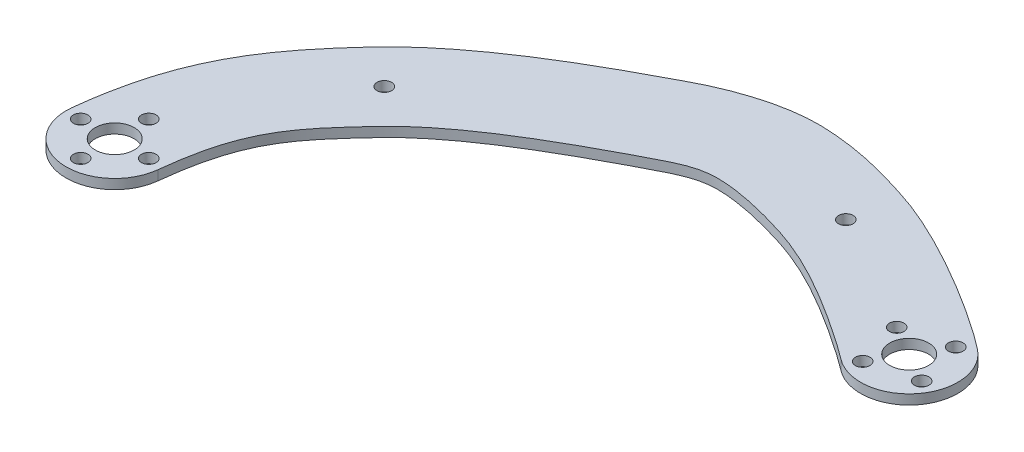
ISO-10303-21;
HEADER;
FILE_DESCRIPTION(('STEP AP214'),'2;1');
FILE_NAME('part.step','',(''),(''),'','','');
FILE_SCHEMA(('AUTOMOTIVE_DESIGN { 1 0 10303 214 1 1 1 1 }'));
ENDSEC;
DATA;
#1=APPLICATION_CONTEXT('core data for automotive mechanical design processes');
#2=APPLICATION_PROTOCOL_DEFINITION('international standard','automotive_design',2000,#1);
#3=PRODUCT_CONTEXT('',#1,'mechanical');
#4=PRODUCT('Part','Part','',(#3));
#5=PRODUCT_RELATED_PRODUCT_CATEGORY('part','',(#4));
#6=PRODUCT_DEFINITION_FORMATION('','',#4);
#7=PRODUCT_DEFINITION_CONTEXT('part definition',#1,'design');
#8=PRODUCT_DEFINITION('design','',#6,#7);
#9=PRODUCT_DEFINITION_SHAPE('','',#8);
#10=(LENGTH_UNIT() NAMED_UNIT(*) SI_UNIT(.MILLI.,.METRE.));
#11=(NAMED_UNIT(*) PLANE_ANGLE_UNIT() SI_UNIT($,.RADIAN.));
#12=(NAMED_UNIT(*) SI_UNIT($,.STERADIAN.) SOLID_ANGLE_UNIT());
#13=UNCERTAINTY_MEASURE_WITH_UNIT(LENGTH_MEASURE(1.E-05),#10,'distance_accuracy_value','');
#14=(GEOMETRIC_REPRESENTATION_CONTEXT(3) GLOBAL_UNCERTAINTY_ASSIGNED_CONTEXT((#13)) GLOBAL_UNIT_ASSIGNED_CONTEXT((#10,
#11,#12)) REPRESENTATION_CONTEXT('',''));
#15=CARTESIAN_POINT('',(0.,0.,0.));
#16=DIRECTION('',(0.,0.,1.));
#17=DIRECTION('',(1.,0.,0.));
#18=AXIS2_PLACEMENT_3D('',#15,#16,#17);
#19=CARTESIAN_POINT('',(-45.8285004379793,-2.,-69.2713280714501));
#20=DIRECTION('',(0.,-1.,0.));
#21=DIRECTION('',(0.,0.,-1.));
#22=AXIS2_PLACEMENT_3D('',#19,#20,#21);
#23=PLANE('',#22);
#24=CARTESIAN_POINT('',(-5.47040483325724,-2.,-60.7458504773583));
#25=DIRECTION('',(0.,1.,0.));
#26=DIRECTION('',(0.,0.,1.));
#27=AXIS2_PLACEMENT_3D('',#24,#25,#26);
#28=CIRCLE('',#27,1.49999999999999);
#29=CARTESIAN_POINT('',(-5.47040483325724,-2.,-59.2458504773583));
#30=VERTEX_POINT('',#29);
#31=EDGE_CURVE('E207',#30,#30,#28,.T.);
#32=ORIENTED_EDGE('',*,*,#31,.T.);
#33=EDGE_LOOP('',(#32));
#34=FACE_BOUND('',#33,.T.);
#35=CARTESIAN_POINT('',(31.0621778264911,-2.,-39.801270189222));
#36=DIRECTION('',(0.,1.,0.));
#37=DIRECTION('',(0.,0.,1.));
#38=AXIS2_PLACEMENT_3D('',#35,#36,#37);
#39=CIRCLE('',#38,1.49999999999999);
#40=CARTESIAN_POINT('',(31.0621778264911,-2.,-38.301270189222));
#41=VERTEX_POINT('',#40);
#42=EDGE_CURVE('E214',#41,#41,#39,.T.);
#43=ORIENTED_EDGE('',*,*,#42,.T.);
#44=EDGE_LOOP('',(#43));
#45=FACE_BOUND('',#44,.T.);
#46=CARTESIAN_POINT('',(-102.,-2.,0.));
#47=DIRECTION('',(0.,1.,0.));
#48=DIRECTION('',(0.,0.,1.));
#49=AXIS2_PLACEMENT_3D('',#46,#47,#48);
#50=CIRCLE('',#49,1.49999999999999);
#51=CARTESIAN_POINT('',(-102.,-2.,1.49999999999996));
#52=VERTEX_POINT('',#51);
#53=EDGE_CURVE('E230',#52,#52,#50,.T.);
#54=ORIENTED_EDGE('',*,*,#53,.T.);
#55=EDGE_LOOP('',(#54));
#56=FACE_BOUND('',#55,.T.);
#57=CARTESIAN_POINT('',(21.5,-2.,-37.2390923627308));
#58=DIRECTION('',(0.,1.,0.));
#59=DIRECTION('',(0.,0.,1.));
#60=AXIS2_PLACEMENT_3D('',#57,#58,#59);
#61=CIRCLE('',#60,1.49999999999999);
#62=CARTESIAN_POINT('',(21.5,-2.,-35.7390923627308));
#63=VERTEX_POINT('',#62);
#64=EDGE_CURVE('E238',#63,#63,#61,.T.);
#65=ORIENTED_EDGE('',*,*,#64,.T.);
#66=EDGE_LOOP('',(#65));
#67=FACE_BOUND('',#66,.T.);
#68=CARTESIAN_POINT('',(-95.,-2.,-7.));
#69=DIRECTION('',(0.,1.,0.));
#70=DIRECTION('',(0.,0.,1.));
#71=AXIS2_PLACEMENT_3D('',#68,#69,#70);
#72=CIRCLE('',#71,1.49999999999999);
#73=CARTESIAN_POINT('',(-95.,-2.,-5.50000000000001));
#74=VERTEX_POINT('',#73);
#75=EDGE_CURVE('E254',#74,#74,#72,.T.);
#76=ORIENTED_EDGE('',*,*,#75,.T.);
#77=EDGE_LOOP('',(#76));
#78=FACE_BOUND('',#77,.T.);
#79=CARTESIAN_POINT('',(-95.,-2.,7.));
#80=DIRECTION('',(0.,1.,0.));
#81=DIRECTION('',(0.,0.,1.));
#82=AXIS2_PLACEMENT_3D('',#79,#80,#81);
#83=CIRCLE('',#82,1.49999999999999);
#84=CARTESIAN_POINT('',(-95.,-2.,8.49999999999999));
#85=VERTEX_POINT('',#84);
#86=EDGE_CURVE('E262',#85,#85,#83,.T.);
#87=ORIENTED_EDGE('',*,*,#86,.T.);
#88=EDGE_LOOP('',(#87));
#89=FACE_BOUND('',#88,.T.);
#90=CARTESIAN_POINT('',(-95.,-2.,0.));
#91=DIRECTION('',(0.,1.,0.));
#92=DIRECTION('',(0.,0.,1.));
#93=AXIS2_PLACEMENT_3D('',#90,#91,#92);
#94=CIRCLE('',#93,3.99999999999999);
#95=CARTESIAN_POINT('',(-95.,-2.,3.99999999999998));
#96=VERTEX_POINT('',#95);
#97=EDGE_CURVE('E278',#96,#96,#94,.T.);
#98=ORIENTED_EDGE('',*,*,#97,.T.);
#99=EDGE_LOOP('',(#98));
#100=FACE_BOUND('',#99,.T.);
#101=CARTESIAN_POINT('',(31.217970731145,-2.,-51.1330541486161));
#102=CARTESIAN_POINT('',(25.2014556905333,-2.,-55.9098093068255));
#103=CARTESIAN_POINT('',(8.34445080884238,-2.,-66.7803505015917));
#104=CARTESIAN_POINT('',(-9.95452359543937,-2.,-72.7368541261571));
#105=CARTESIAN_POINT('',(-16.0661517941738,-2.,-74.5136017831696));
#106=CARTESIAN_POINT('',(-31.4946292124106,-2.,-75.2497131484379));
#107=CARTESIAN_POINT('',(-39.7481312890882,-2.,-72.4528282758718));
#108=CARTESIAN_POINT('',(-57.9892387357613,-2.,-62.9083276626067));
#109=CARTESIAN_POINT('',(-74.5148871539062,-2.,-54.0090213221811));
#110=CARTESIAN_POINT('',(-95.3612296301583,-2.,-31.4574289545693));
#111=CARTESIAN_POINT('',(-102.721578545527,-2.,-21.252373985937));
#112=CARTESIAN_POINT('',(-104.939991114334,-2.,-1.09388145927961));
#113=B_SPLINE_CURVE_WITH_KNOTS('',3,(#101,#102,#103,#104,#105,#106,#107,#108,#109,#110,#111,
#112),.UNSPECIFIED.,.F.,.F.,(4,2,2,2,2,4),(0.,0.25,0.375,0.5,0.75,1.),.UNSPECIFIED.);
#114=CARTESIAN_POINT('',(31.217970731145,-2.,-51.1330541486161));
#115=VERTEX_POINT('',#114);
#116=CARTESIAN_POINT('',(-104.939991114334,-2.,-1.09388145927963));
#117=VERTEX_POINT('',#116);
#118=EDGE_CURVE('E105',#115,#117,#113,.T.);
#119=ORIENTED_EDGE('',*,*,#118,.F.);
#120=CARTESIAN_POINT('',(25.,-2.,-43.3012701892219));
#121=DIRECTION('',(0.,1.,0.));
#122=DIRECTION('',(0.,0.,1.));
#123=AXIS2_PLACEMENT_3D('',#120,#121,#122);
#124=CIRCLE('',#123,10.);
#125=CARTESIAN_POINT('',(18.782029268855,-2.,-35.4694862298277));
#126=VERTEX_POINT('',#125);
#127=EDGE_CURVE('E100',#126,#115,#124,.T.);
#128=ORIENTED_EDGE('',*,*,#127,.F.);
#129=CARTESIAN_POINT('',(-85.0600088856657,-2.,1.09388145927961));
#130=CARTESIAN_POINT('',(-83.2733930868187,-2.,-15.1409171238939));
#131=CARTESIAN_POINT('',(-78.4954168347907,-2.,-20.2491444472598));
#132=CARTESIAN_POINT('',(-62.0101963965591,-2.,-38.0641836130827));
#133=CARTESIAN_POINT('',(-47.2799847653409,-2.,-45.9573966791849));
#134=CARTESIAN_POINT('',(-31.2342855377627,-2.,-54.325875613252));
#135=CARTESIAN_POINT('',(-28.9509837540831,-2.,-55.1128016284582));
#136=CARTESIAN_POINT('',(-20.5534684122021,-2.,-54.7013000009219));
#137=CARTESIAN_POINT('',(-14.7921061287828,-2.,-53.2658446509368));
#138=CARTESIAN_POINT('',(-5.22837928003915,-2.,-50.1740620308894));
#139=CARTESIAN_POINT('',(-0.197175706277112,-2.,-47.7617051834466));
#140=CARTESIAN_POINT('',(11.5843464499819,-2.,-40.6634390769694));
#141=CARTESIAN_POINT('',(17.421875588584,-2.,-36.5493673677186));
#142=CARTESIAN_POINT('',(18.782029268855,-2.,-35.4694862298277));
#143=B_SPLINE_CURVE_WITH_KNOTS('',3,(#129,#130,#131,#132,#133,#134,#135,#136,#137,#138,#139,
#140,#141,#142),.UNSPECIFIED.,.F.,.F.,(4,2,2,2,2,2,4),(0.,0.25,0.5,0.625,0.75,0.875,1.),.UNSPECIFIED.);
#144=CARTESIAN_POINT('',(-85.0600088856657,-2.,1.09388145927961));
#145=VERTEX_POINT('',#144);
#146=EDGE_CURVE('E92',#145,#126,#143,.T.);
#147=ORIENTED_EDGE('',*,*,#146,.F.);
#148=CARTESIAN_POINT('',(-95.,-2.,0.));
#149=DIRECTION('',(0.,1.,0.));
#150=DIRECTION('',(0.,0.,1.));
#151=AXIS2_PLACEMENT_3D('',#148,#149,#150);
#152=CIRCLE('',#151,9.99999999999988);
#153=EDGE_CURVE('E99',#117,#145,#152,.T.);
#154=ORIENTED_EDGE('',*,*,#153,.F.);
#155=EDGE_LOOP('',(#119,#128,#147,#154));
#156=FACE_BOUND('',#155,.T.);
#157=CARTESIAN_POINT('',(25.,-2.,-43.3012701892219));
#158=DIRECTION('',(0.,1.,0.));
#159=DIRECTION('',(0.,0.,1.));
#160=AXIS2_PLACEMENT_3D('',#157,#158,#159);
#161=CIRCLE('',#160,3.99999999999999);
#162=CARTESIAN_POINT('',(25.,-2.,-39.3012701892219));
#163=VERTEX_POINT('',#162);
#164=EDGE_CURVE('E283',#163,#163,#161,.T.);
#165=ORIENTED_EDGE('',*,*,#164,.T.);
#166=EDGE_LOOP('',(#165));
#167=FACE_BOUND('',#166,.T.);
#168=CARTESIAN_POINT('',(18.9378221735089,-2.,-46.8012701892219));
#169=DIRECTION('',(0.,1.,0.));
#170=DIRECTION('',(0.,0.,1.));
#171=AXIS2_PLACEMENT_3D('',#168,#169,#170);
#172=CIRCLE('',#171,1.49999999999999);
#173=CARTESIAN_POINT('',(18.9378221735089,-2.,-45.3012701892219));
#174=VERTEX_POINT('',#173);
#175=EDGE_CURVE('E270',#174,#174,#172,.T.);
#176=ORIENTED_EDGE('',*,*,#175,.T.);
#177=EDGE_LOOP('',(#176));
#178=FACE_BOUND('',#177,.T.);
#179=CARTESIAN_POINT('',(28.5,-2.,-49.363448015713));
#180=DIRECTION('',(0.,1.,0.));
#181=DIRECTION('',(0.,0.,1.));
#182=AXIS2_PLACEMENT_3D('',#179,#180,#181);
#183=CIRCLE('',#182,1.49999999999999);
#184=CARTESIAN_POINT('',(28.5,-2.,-47.863448015713));
#185=VERTEX_POINT('',#184);
#186=EDGE_CURVE('E246',#185,#185,#183,.T.);
#187=ORIENTED_EDGE('',*,*,#186,.T.);
#188=EDGE_LOOP('',(#187));
#189=FACE_BOUND('',#188,.T.);
#190=CARTESIAN_POINT('',(-88.,-2.,0.));
#191=DIRECTION('',(0.,1.,0.));
#192=DIRECTION('',(0.,0.,1.));
#193=AXIS2_PLACEMENT_3D('',#190,#191,#192);
#194=CIRCLE('',#193,1.49999999999999);
#195=CARTESIAN_POINT('',(-88.,-2.,1.49999999999999));
#196=VERTEX_POINT('',#195);
#197=EDGE_CURVE('E222',#196,#196,#194,.T.);
#198=ORIENTED_EDGE('',*,*,#197,.T.);
#199=EDGE_LOOP('',(#198));
#200=FACE_BOUND('',#199,.T.);
#201=CARTESIAN_POINT('',(-76.5973956309098,-2.,-37.0062331272977));
#202=DIRECTION('',(0.,1.,0.));
#203=DIRECTION('',(0.,0.,1.));
#204=AXIS2_PLACEMENT_3D('',#201,#202,#203);
#205=CIRCLE('',#204,1.49999999999999);
#206=CARTESIAN_POINT('',(-76.5973956309098,-2.,-35.5062331272977));
#207=VERTEX_POINT('',#206);
#208=EDGE_CURVE('E192',#207,#207,#205,.T.);
#209=ORIENTED_EDGE('',*,*,#208,.T.);
#210=EDGE_LOOP('',(#209));
#211=FACE_BOUND('',#210,.T.);
#212=ADVANCED_FACE('F41',(#34,#45,#56,#67,#78,#89,#100,#156,#167,#178,#189,#200,#211),#23,.T.);
#213=CARTESIAN_POINT('',(-45.8285004379793,0.,-69.2713280714501));
#214=DIRECTION('',(0.,-1.,0.));
#215=DIRECTION('',(0.,0.,-1.));
#216=AXIS2_PLACEMENT_3D('',#213,#214,#215);
#217=PLANE('',#216);
#218=CARTESIAN_POINT('',(-76.5973956309098,0.,-37.0062331272977));
#219=DIRECTION('',(0.,1.,0.));
#220=DIRECTION('',(0.,0.,1.));
#221=AXIS2_PLACEMENT_3D('',#218,#219,#220);
#222=CIRCLE('',#221,1.49999999999999);
#223=CARTESIAN_POINT('',(-76.5973956309098,0.,-35.5062331272977));
#224=VERTEX_POINT('',#223);
#225=EDGE_CURVE('E195',#224,#224,#222,.T.);
#226=ORIENTED_EDGE('',*,*,#225,.F.);
#227=EDGE_LOOP('',(#226));
#228=FACE_BOUND('',#227,.T.);
#229=CARTESIAN_POINT('',(-102.,0.,0.));
#230=DIRECTION('',(0.,1.,0.));
#231=DIRECTION('',(0.,0.,1.));
#232=AXIS2_PLACEMENT_3D('',#229,#230,#231);
#233=CIRCLE('',#232,1.49999999999999);
#234=CARTESIAN_POINT('',(-102.,0.,1.49999999999996));
#235=VERTEX_POINT('',#234);
#236=EDGE_CURVE('E226',#235,#235,#233,.T.);
#237=ORIENTED_EDGE('',*,*,#236,.F.);
#238=EDGE_LOOP('',(#237));
#239=FACE_BOUND('',#238,.T.);
#240=CARTESIAN_POINT('',(21.5,0.,-37.2390923627308));
#241=DIRECTION('',(0.,1.,0.));
#242=DIRECTION('',(0.,0.,1.));
#243=AXIS2_PLACEMENT_3D('',#240,#241,#242);
#244=CIRCLE('',#243,1.49999999999999);
#245=CARTESIAN_POINT('',(21.5,0.,-35.7390923627308));
#246=VERTEX_POINT('',#245);
#247=EDGE_CURVE('E234',#246,#246,#244,.T.);
#248=ORIENTED_EDGE('',*,*,#247,.F.);
#249=EDGE_LOOP('',(#248));
#250=FACE_BOUND('',#249,.T.);
#251=CARTESIAN_POINT('',(-95.,0.,7.));
#252=DIRECTION('',(0.,1.,0.));
#253=DIRECTION('',(0.,0.,1.));
#254=AXIS2_PLACEMENT_3D('',#251,#252,#253);
#255=CIRCLE('',#254,1.49999999999999);
#256=CARTESIAN_POINT('',(-95.,0.,8.49999999999999));
#257=VERTEX_POINT('',#256);
#258=EDGE_CURVE('E258',#257,#257,#255,.T.);
#259=ORIENTED_EDGE('',*,*,#258,.F.);
#260=EDGE_LOOP('',(#259));
#261=FACE_BOUND('',#260,.T.);
#262=CARTESIAN_POINT('',(-95.,0.,0.));
#263=DIRECTION('',(0.,1.,0.));
#264=DIRECTION('',(0.,0.,1.));
#265=AXIS2_PLACEMENT_3D('',#262,#263,#264);
#266=CIRCLE('',#265,3.99999999999999);
#267=CARTESIAN_POINT('',(-95.,0.,3.99999999999998));
#268=VERTEX_POINT('',#267);
#269=EDGE_CURVE('E274',#268,#268,#266,.T.);
#270=ORIENTED_EDGE('',*,*,#269,.F.);
#271=EDGE_LOOP('',(#270));
#272=FACE_BOUND('',#271,.T.);
#273=CARTESIAN_POINT('',(25.,0.,-43.3012701892219));
#274=DIRECTION('',(0.,1.,0.));
#275=DIRECTION('',(0.,0.,1.));
#276=AXIS2_PLACEMENT_3D('',#273,#274,#275);
#277=CIRCLE('',#276,3.99999999999999);
#278=CARTESIAN_POINT('',(25.,0.,-39.3012701892219));
#279=VERTEX_POINT('',#278);
#280=EDGE_CURVE('E281',#279,#279,#277,.T.);
#281=ORIENTED_EDGE('',*,*,#280,.F.);
#282=EDGE_LOOP('',(#281));
#283=FACE_BOUND('',#282,.T.);
#284=CARTESIAN_POINT('',(31.217970731145,0.,-51.1330541486161));
#285=CARTESIAN_POINT('',(25.2014556905333,0.,-55.9098093068255));
#286=CARTESIAN_POINT('',(8.34445080884238,0.,-66.7803505015917));
#287=CARTESIAN_POINT('',(-9.95452359543937,0.,-72.7368541261571));
#288=CARTESIAN_POINT('',(-16.0661517941738,0.,-74.5136017831696));
#289=CARTESIAN_POINT('',(-31.4946292124106,0.,-75.2497131484379));
#290=CARTESIAN_POINT('',(-39.7481312890882,0.,-72.4528282758718));
#291=CARTESIAN_POINT('',(-57.9892387357613,0.,-62.9083276626067));
#292=CARTESIAN_POINT('',(-74.5148871539062,0.,-54.0090213221811));
#293=CARTESIAN_POINT('',(-95.3612296301583,0.,-31.4574289545693));
#294=CARTESIAN_POINT('',(-102.721578545527,0.,-21.252373985937));
#295=CARTESIAN_POINT('',(-104.939991114334,0.,-1.09388145927961));
#296=B_SPLINE_CURVE_WITH_KNOTS('',3,(#284,#285,#286,#287,#288,#289,#290,#291,#292,#293,#294,
#295),.UNSPECIFIED.,.F.,.F.,(4,2,2,2,2,4),(0.,0.25,0.375,0.5,0.75,1.),.UNSPECIFIED.);
#297=CARTESIAN_POINT('',(31.217970731145,0.,-51.1330541486161));
#298=VERTEX_POINT('',#297);
#299=CARTESIAN_POINT('',(-104.939991114334,0.,-1.09388145927963));
#300=VERTEX_POINT('',#299);
#301=EDGE_CURVE('E286',#298,#300,#296,.T.);
#302=ORIENTED_EDGE('',*,*,#301,.T.);
#303=CARTESIAN_POINT('',(-95.,0.,0.));
#304=DIRECTION('',(0.,1.,0.));
#305=DIRECTION('',(0.,0.,1.));
#306=AXIS2_PLACEMENT_3D('',#303,#304,#305);
#307=CIRCLE('',#306,9.99999999999988);
#308=CARTESIAN_POINT('',(-85.0600088856657,0.,1.09388145927961));
#309=VERTEX_POINT('',#308);
#310=EDGE_CURVE('E292',#300,#309,#307,.T.);
#311=ORIENTED_EDGE('',*,*,#310,.T.);
#312=CARTESIAN_POINT('',(-85.0600088856657,0.,1.09388145927961));
#313=CARTESIAN_POINT('',(-83.2733930868187,0.,-15.1409171238939));
#314=CARTESIAN_POINT('',(-78.4954168347907,0.,-20.2491444472598));
#315=CARTESIAN_POINT('',(-62.0101963965591,0.,-38.0641836130827));
#316=CARTESIAN_POINT('',(-47.2799847653409,0.,-45.9573966791849));
#317=CARTESIAN_POINT('',(-31.2342855377627,0.,-54.325875613252));
#318=CARTESIAN_POINT('',(-28.9509837540831,0.,-55.1128016284582));
#319=CARTESIAN_POINT('',(-20.5534684122021,0.,-54.7013000009219));
#320=CARTESIAN_POINT('',(-14.7921061287828,0.,-53.2658446509368));
#321=CARTESIAN_POINT('',(-5.22837928003915,0.,-50.1740620308894));
#322=CARTESIAN_POINT('',(-0.197175706277112,0.,-47.7617051834466));
#323=CARTESIAN_POINT('',(11.5843464499819,0.,-40.6634390769694));
#324=CARTESIAN_POINT('',(17.421875588584,0.,-36.5493673677186));
#325=CARTESIAN_POINT('',(18.782029268855,0.,-35.4694862298277));
#326=B_SPLINE_CURVE_WITH_KNOTS('',3,(#312,#313,#314,#315,#316,#317,#318,#319,#320,#321,#322,
#323,#324,#325),.UNSPECIFIED.,.F.,.F.,(4,2,2,2,2,2,4),(0.,0.25,0.5,0.625,0.75,0.875,1.),.UNSPECIFIED.);
#327=CARTESIAN_POINT('',(18.782029268855,0.,-35.4694862298277));
#328=VERTEX_POINT('',#327);
#329=EDGE_CURVE('E94',#309,#328,#326,.T.);
#330=ORIENTED_EDGE('',*,*,#329,.T.);
#331=CARTESIAN_POINT('',(25.,0.,-43.3012701892219));
#332=DIRECTION('',(0.,1.,0.));
#333=DIRECTION('',(0.,0.,1.));
#334=AXIS2_PLACEMENT_3D('',#331,#332,#333);
#335=CIRCLE('',#334,10.);
#336=EDGE_CURVE('E108',#328,#298,#335,.T.);
#337=ORIENTED_EDGE('',*,*,#336,.T.);
#338=EDGE_LOOP('',(#302,#311,#330,#337));
#339=FACE_BOUND('',#338,.T.);
#340=CARTESIAN_POINT('',(18.9378221735089,0.,-46.8012701892219));
#341=DIRECTION('',(0.,1.,0.));
#342=DIRECTION('',(0.,0.,1.));
#343=AXIS2_PLACEMENT_3D('',#340,#341,#342);
#344=CIRCLE('',#343,1.49999999999999);
#345=CARTESIAN_POINT('',(18.9378221735089,0.,-45.3012701892219));
#346=VERTEX_POINT('',#345);
#347=EDGE_CURVE('E266',#346,#346,#344,.T.);
#348=ORIENTED_EDGE('',*,*,#347,.F.);
#349=EDGE_LOOP('',(#348));
#350=FACE_BOUND('',#349,.T.);
#351=CARTESIAN_POINT('',(-95.,0.,-7.));
#352=DIRECTION('',(0.,1.,0.));
#353=DIRECTION('',(0.,0.,1.));
#354=AXIS2_PLACEMENT_3D('',#351,#352,#353);
#355=CIRCLE('',#354,1.49999999999999);
#356=CARTESIAN_POINT('',(-95.,0.,-5.50000000000001));
#357=VERTEX_POINT('',#356);
#358=EDGE_CURVE('E250',#357,#357,#355,.T.);
#359=ORIENTED_EDGE('',*,*,#358,.F.);
#360=EDGE_LOOP('',(#359));
#361=FACE_BOUND('',#360,.T.);
#362=CARTESIAN_POINT('',(28.5,0.,-49.363448015713));
#363=DIRECTION('',(0.,1.,0.));
#364=DIRECTION('',(0.,0.,1.));
#365=AXIS2_PLACEMENT_3D('',#362,#363,#364);
#366=CIRCLE('',#365,1.49999999999999);
#367=CARTESIAN_POINT('',(28.5,0.,-47.863448015713));
#368=VERTEX_POINT('',#367);
#369=EDGE_CURVE('E242',#368,#368,#366,.T.);
#370=ORIENTED_EDGE('',*,*,#369,.F.);
#371=EDGE_LOOP('',(#370));
#372=FACE_BOUND('',#371,.T.);
#373=CARTESIAN_POINT('',(-88.,0.,0.));
#374=DIRECTION('',(0.,1.,0.));
#375=DIRECTION('',(0.,0.,1.));
#376=AXIS2_PLACEMENT_3D('',#373,#374,#375);
#377=CIRCLE('',#376,1.49999999999999);
#378=CARTESIAN_POINT('',(-88.,0.,1.49999999999999));
#379=VERTEX_POINT('',#378);
#380=EDGE_CURVE('E218',#379,#379,#377,.T.);
#381=ORIENTED_EDGE('',*,*,#380,.F.);
#382=EDGE_LOOP('',(#381));
#383=FACE_BOUND('',#382,.T.);
#384=CARTESIAN_POINT('',(31.0621778264911,0.,-39.801270189222));
#385=DIRECTION('',(0.,1.,0.));
#386=DIRECTION('',(0.,0.,1.));
#387=AXIS2_PLACEMENT_3D('',#384,#385,#386);
#388=CIRCLE('',#387,1.49999999999999);
#389=CARTESIAN_POINT('',(31.0621778264911,0.,-38.301270189222));
#390=VERTEX_POINT('',#389);
#391=EDGE_CURVE('E210',#390,#390,#388,.T.);
#392=ORIENTED_EDGE('',*,*,#391,.F.);
#393=EDGE_LOOP('',(#392));
#394=FACE_BOUND('',#393,.T.);
#395=CARTESIAN_POINT('',(-5.47040483325724,0.,-60.7458504773583));
#396=DIRECTION('',(0.,1.,0.));
#397=DIRECTION('',(0.,0.,1.));
#398=AXIS2_PLACEMENT_3D('',#395,#396,#397);
#399=CIRCLE('',#398,1.49999999999999);
#400=CARTESIAN_POINT('',(-5.47040483325724,0.,-59.2458504773583));
#401=VERTEX_POINT('',#400);
#402=EDGE_CURVE('E201',#401,#401,#399,.T.);
#403=ORIENTED_EDGE('',*,*,#402,.F.);
#404=EDGE_LOOP('',(#403));
#405=FACE_BOUND('',#404,.T.);
#406=ADVANCED_FACE('F135',(#228,#239,#250,#261,#272,#283,#339,#350,#361,#372,#383,#394,#405),
#217,.F.);
#407=DIRECTION('',(0.,1.,0.));
#408=VECTOR('',#407,1.);
#409=SURFACE_OF_LINEAR_EXTRUSION('',#113,#408);
#410=ORIENTED_EDGE('',*,*,#301,.F.);
#411=DIRECTION('',(0.,1.,0.));
#412=VECTOR('',#411,1.);
#413=CARTESIAN_POINT('',(31.217970731145,-2.,-51.1330541486161));
#414=LINE('',#413,#412);
#415=EDGE_CURVE('E11',#115,#298,#414,.T.);
#416=ORIENTED_EDGE('',*,*,#415,.F.);
#417=ORIENTED_EDGE('',*,*,#118,.T.);
#418=DIRECTION('',(0.,1.,0.));
#419=VECTOR('',#418,1.);
#420=CARTESIAN_POINT('',(-104.939991114334,-2.,-1.09388145927963));
#421=LINE('',#420,#419);
#422=EDGE_CURVE('E46',#117,#300,#421,.T.);
#423=ORIENTED_EDGE('',*,*,#422,.T.);
#424=EDGE_LOOP('',(#410,#416,#417,#423));
#425=FACE_BOUND('',#424,.T.);
#426=ADVANCED_FACE('F43',(#425),#409,.T.);
#427=CARTESIAN_POINT('',(25.,-2.,-43.3012701892219));
#428=DIRECTION('',(0.,1.,0.));
#429=DIRECTION('',(0.,0.,1.));
#430=AXIS2_PLACEMENT_3D('',#427,#428,#429);
#431=CYLINDRICAL_SURFACE('',#430,10.);
#432=ORIENTED_EDGE('',*,*,#336,.F.);
#433=DIRECTION('',(0.,1.,0.));
#434=VECTOR('',#433,1.);
#435=CARTESIAN_POINT('',(18.782029268855,-2.,-35.4694862298277));
#436=LINE('',#435,#434);
#437=EDGE_CURVE('E53',#126,#328,#436,.T.);
#438=ORIENTED_EDGE('',*,*,#437,.F.);
#439=ORIENTED_EDGE('',*,*,#127,.T.);
#440=ORIENTED_EDGE('',*,*,#415,.T.);
#441=EDGE_LOOP('',(#432,#438,#439,#440));
#442=FACE_BOUND('',#441,.T.);
#443=ADVANCED_FACE('F124',(#442),#431,.T.);
#444=DIRECTION('',(0.,1.,0.));
#445=VECTOR('',#444,1.);
#446=SURFACE_OF_LINEAR_EXTRUSION('',#143,#445);
#447=ORIENTED_EDGE('',*,*,#329,.F.);
#448=DIRECTION('',(0.,1.,0.));
#449=VECTOR('',#448,1.);
#450=CARTESIAN_POINT('',(-85.0600088856657,-2.,1.09388145927961));
#451=LINE('',#450,#449);
#452=EDGE_CURVE('E89',#145,#309,#451,.T.);
#453=ORIENTED_EDGE('',*,*,#452,.F.);
#454=ORIENTED_EDGE('',*,*,#146,.T.);
#455=ORIENTED_EDGE('',*,*,#437,.T.);
#456=EDGE_LOOP('',(#447,#453,#454,#455));
#457=FACE_BOUND('',#456,.T.);
#458=ADVANCED_FACE('F91',(#457),#446,.T.);
#459=CARTESIAN_POINT('',(-95.,-2.,0.));
#460=DIRECTION('',(0.,1.,0.));
#461=DIRECTION('',(0.,0.,1.));
#462=AXIS2_PLACEMENT_3D('',#459,#460,#461);
#463=CYLINDRICAL_SURFACE('',#462,9.99999999999988);
#464=ORIENTED_EDGE('',*,*,#310,.F.);
#465=ORIENTED_EDGE('',*,*,#422,.F.);
#466=ORIENTED_EDGE('',*,*,#153,.T.);
#467=ORIENTED_EDGE('',*,*,#452,.T.);
#468=EDGE_LOOP('',(#464,#465,#466,#467));
#469=FACE_BOUND('',#468,.T.);
#470=ADVANCED_FACE('F103',(#469),#463,.T.);
#471=CARTESIAN_POINT('',(25.,0.,-43.3012701892219));
#472=DIRECTION('',(0.,1.,0.));
#473=DIRECTION('',(0.,0.,1.));
#474=AXIS2_PLACEMENT_3D('',#471,#472,#473);
#475=CYLINDRICAL_SURFACE('',#474,3.99999999999999);
#476=ORIENTED_EDGE('',*,*,#164,.F.);
#477=EDGE_LOOP('',(#476));
#478=FACE_BOUND('',#477,.T.);
#479=ORIENTED_EDGE('',*,*,#280,.T.);
#480=EDGE_LOOP('',(#479));
#481=FACE_BOUND('',#480,.T.);
#482=ADVANCED_FACE('F127',(#478,#481),#475,.F.);
#483=CARTESIAN_POINT('',(-95.,0.,0.));
#484=DIRECTION('',(0.,1.,0.));
#485=DIRECTION('',(0.,0.,1.));
#486=AXIS2_PLACEMENT_3D('',#483,#484,#485);
#487=CYLINDRICAL_SURFACE('',#486,3.99999999999999);
#488=ORIENTED_EDGE('',*,*,#97,.F.);
#489=EDGE_LOOP('',(#488));
#490=FACE_BOUND('',#489,.T.);
#491=ORIENTED_EDGE('',*,*,#269,.T.);
#492=EDGE_LOOP('',(#491));
#493=FACE_BOUND('',#492,.T.);
#494=ADVANCED_FACE('F131',(#490,#493),#487,.F.);
#495=CARTESIAN_POINT('',(18.9378221735089,0.,-46.8012701892219));
#496=DIRECTION('',(0.,1.,0.));
#497=DIRECTION('',(0.,0.,1.));
#498=AXIS2_PLACEMENT_3D('',#495,#496,#497);
#499=CYLINDRICAL_SURFACE('',#498,1.49999999999999);
#500=ORIENTED_EDGE('',*,*,#175,.F.);
#501=EDGE_LOOP('',(#500));
#502=FACE_BOUND('',#501,.T.);
#503=ORIENTED_EDGE('',*,*,#347,.T.);
#504=EDGE_LOOP('',(#503));
#505=FACE_BOUND('',#504,.T.);
#506=ADVANCED_FACE('F147',(#502,#505),#499,.F.);
#507=CARTESIAN_POINT('',(-95.,0.,7.));
#508=DIRECTION('',(0.,1.,0.));
#509=DIRECTION('',(0.,0.,1.));
#510=AXIS2_PLACEMENT_3D('',#507,#508,#509);
#511=CYLINDRICAL_SURFACE('',#510,1.49999999999999);
#512=ORIENTED_EDGE('',*,*,#86,.F.);
#513=EDGE_LOOP('',(#512));
#514=FACE_BOUND('',#513,.T.);
#515=ORIENTED_EDGE('',*,*,#258,.T.);
#516=EDGE_LOOP('',(#515));
#517=FACE_BOUND('',#516,.T.);
#518=ADVANCED_FACE('F151',(#514,#517),#511,.F.);
#519=CARTESIAN_POINT('',(-95.,0.,-7.));
#520=DIRECTION('',(0.,1.,0.));
#521=DIRECTION('',(0.,0.,1.));
#522=AXIS2_PLACEMENT_3D('',#519,#520,#521);
#523=CYLINDRICAL_SURFACE('',#522,1.49999999999999);
#524=ORIENTED_EDGE('',*,*,#75,.F.);
#525=EDGE_LOOP('',(#524));
#526=FACE_BOUND('',#525,.T.);
#527=ORIENTED_EDGE('',*,*,#358,.T.);
#528=EDGE_LOOP('',(#527));
#529=FACE_BOUND('',#528,.T.);
#530=ADVANCED_FACE('F155',(#526,#529),#523,.F.);
#531=CARTESIAN_POINT('',(28.5,0.,-49.363448015713));
#532=DIRECTION('',(0.,1.,0.));
#533=DIRECTION('',(0.,0.,1.));
#534=AXIS2_PLACEMENT_3D('',#531,#532,#533);
#535=CYLINDRICAL_SURFACE('',#534,1.49999999999999);
#536=ORIENTED_EDGE('',*,*,#186,.F.);
#537=EDGE_LOOP('',(#536));
#538=FACE_BOUND('',#537,.T.);
#539=ORIENTED_EDGE('',*,*,#369,.T.);
#540=EDGE_LOOP('',(#539));
#541=FACE_BOUND('',#540,.T.);
#542=ADVANCED_FACE('F159',(#538,#541),#535,.F.);
#543=CARTESIAN_POINT('',(21.5,0.,-37.2390923627308));
#544=DIRECTION('',(0.,1.,0.));
#545=DIRECTION('',(0.,0.,1.));
#546=AXIS2_PLACEMENT_3D('',#543,#544,#545);
#547=CYLINDRICAL_SURFACE('',#546,1.49999999999999);
#548=ORIENTED_EDGE('',*,*,#64,.F.);
#549=EDGE_LOOP('',(#548));
#550=FACE_BOUND('',#549,.T.);
#551=ORIENTED_EDGE('',*,*,#247,.T.);
#552=EDGE_LOOP('',(#551));
#553=FACE_BOUND('',#552,.T.);
#554=ADVANCED_FACE('F163',(#550,#553),#547,.F.);
#555=CARTESIAN_POINT('',(-102.,0.,0.));
#556=DIRECTION('',(0.,1.,0.));
#557=DIRECTION('',(0.,0.,1.));
#558=AXIS2_PLACEMENT_3D('',#555,#556,#557);
#559=CYLINDRICAL_SURFACE('',#558,1.49999999999999);
#560=ORIENTED_EDGE('',*,*,#53,.F.);
#561=EDGE_LOOP('',(#560));
#562=FACE_BOUND('',#561,.T.);
#563=ORIENTED_EDGE('',*,*,#236,.T.);
#564=EDGE_LOOP('',(#563));
#565=FACE_BOUND('',#564,.T.);
#566=ADVANCED_FACE('F167',(#562,#565),#559,.F.);
#567=CARTESIAN_POINT('',(-88.,0.,0.));
#568=DIRECTION('',(0.,1.,0.));
#569=DIRECTION('',(0.,0.,1.));
#570=AXIS2_PLACEMENT_3D('',#567,#568,#569);
#571=CYLINDRICAL_SURFACE('',#570,1.49999999999999);
#572=ORIENTED_EDGE('',*,*,#197,.F.);
#573=EDGE_LOOP('',(#572));
#574=FACE_BOUND('',#573,.T.);
#575=ORIENTED_EDGE('',*,*,#380,.T.);
#576=EDGE_LOOP('',(#575));
#577=FACE_BOUND('',#576,.T.);
#578=ADVANCED_FACE('F171',(#574,#577),#571,.F.);
#579=CARTESIAN_POINT('',(31.0621778264911,0.,-39.801270189222));
#580=DIRECTION('',(0.,1.,0.));
#581=DIRECTION('',(0.,0.,1.));
#582=AXIS2_PLACEMENT_3D('',#579,#580,#581);
#583=CYLINDRICAL_SURFACE('',#582,1.49999999999999);
#584=ORIENTED_EDGE('',*,*,#42,.F.);
#585=EDGE_LOOP('',(#584));
#586=FACE_BOUND('',#585,.T.);
#587=ORIENTED_EDGE('',*,*,#391,.T.);
#588=EDGE_LOOP('',(#587));
#589=FACE_BOUND('',#588,.T.);
#590=ADVANCED_FACE('F175',(#586,#589),#583,.F.);
#591=CARTESIAN_POINT('',(-5.47040483325724,0.,-60.7458504773583));
#592=DIRECTION('',(0.,1.,0.));
#593=DIRECTION('',(0.,0.,1.));
#594=AXIS2_PLACEMENT_3D('',#591,#592,#593);
#595=CYLINDRICAL_SURFACE('',#594,1.49999999999999);
#596=ORIENTED_EDGE('',*,*,#31,.F.);
#597=EDGE_LOOP('',(#596));
#598=FACE_BOUND('',#597,.T.);
#599=ORIENTED_EDGE('',*,*,#402,.T.);
#600=EDGE_LOOP('',(#599));
#601=FACE_BOUND('',#600,.T.);
#602=ADVANCED_FACE('F179',(#598,#601),#595,.F.);
#603=CARTESIAN_POINT('',(-76.5973956309098,0.,-37.0062331272977));
#604=DIRECTION('',(0.,1.,0.));
#605=DIRECTION('',(0.,0.,1.));
#606=AXIS2_PLACEMENT_3D('',#603,#604,#605);
#607=CYLINDRICAL_SURFACE('',#606,1.49999999999999);
#608=ORIENTED_EDGE('',*,*,#208,.F.);
#609=EDGE_LOOP('',(#608));
#610=FACE_BOUND('',#609,.T.);
#611=ORIENTED_EDGE('',*,*,#225,.T.);
#612=EDGE_LOOP('',(#611));
#613=FACE_BOUND('',#612,.T.);
#614=ADVANCED_FACE('F183',(#610,#613),#607,.F.);
#615=CLOSED_SHELL('',(#212,#406,#426,#443,#458,#470,#482,#494,#506,#518,#530,#542,#554,#566,
#578,#590,#602,#614));
#616=MANIFOLD_SOLID_BREP('B2',#615);
#617=ADVANCED_BREP_SHAPE_REPRESENTATION('',(#18,#616),#14);
#618=SHAPE_DEFINITION_REPRESENTATION(#9,#617);
ENDSEC;
END-ISO-10303-21;
